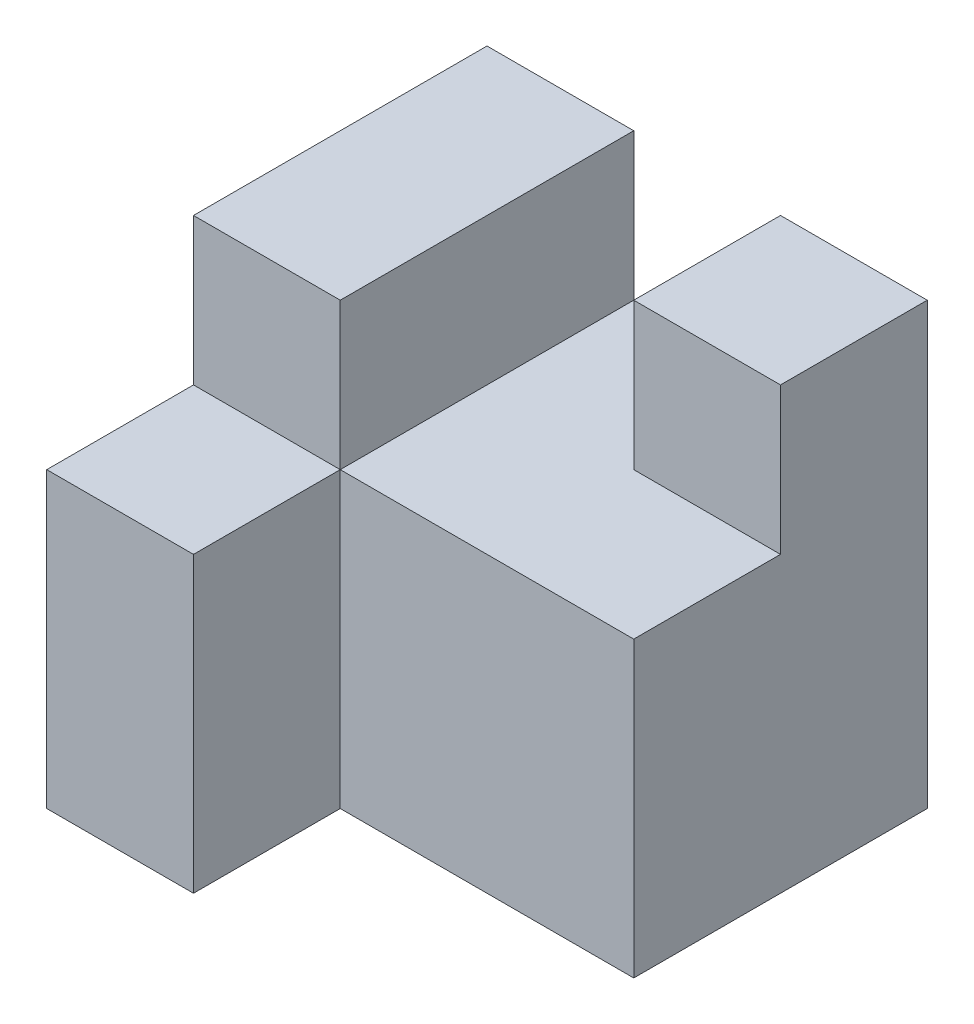
ISO-10303-21;
HEADER;
FILE_DESCRIPTION(('STEP AP214'),'2;1');
FILE_NAME('part.step','',(''),(''),'','','');
FILE_SCHEMA(('AUTOMOTIVE_DESIGN { 1 0 10303 214 1 1 1 1 }'));
ENDSEC;
DATA;
#1=APPLICATION_CONTEXT('core data for automotive mechanical design processes');
#2=APPLICATION_PROTOCOL_DEFINITION('international standard','automotive_design',2000,#1);
#3=PRODUCT_CONTEXT('',#1,'mechanical');
#4=PRODUCT('Part','Part','',(#3));
#5=PRODUCT_RELATED_PRODUCT_CATEGORY('part','',(#4));
#6=PRODUCT_DEFINITION_FORMATION('','',#4);
#7=PRODUCT_DEFINITION_CONTEXT('part definition',#1,'design');
#8=PRODUCT_DEFINITION('design','',#6,#7);
#9=PRODUCT_DEFINITION_SHAPE('','',#8);
#10=(LENGTH_UNIT() NAMED_UNIT(*) SI_UNIT(.MILLI.,.METRE.));
#11=(NAMED_UNIT(*) PLANE_ANGLE_UNIT() SI_UNIT($,.RADIAN.));
#12=(NAMED_UNIT(*) SI_UNIT($,.STERADIAN.) SOLID_ANGLE_UNIT());
#13=UNCERTAINTY_MEASURE_WITH_UNIT(LENGTH_MEASURE(1.E-05),#10,'distance_accuracy_value','');
#14=(GEOMETRIC_REPRESENTATION_CONTEXT(3) GLOBAL_UNCERTAINTY_ASSIGNED_CONTEXT((#13)) GLOBAL_UNIT_ASSIGNED_CONTEXT((#10,
#11,#12)) REPRESENTATION_CONTEXT('',''));
#15=CARTESIAN_POINT('',(0.,0.,0.));
#16=DIRECTION('',(0.,0.,1.));
#17=DIRECTION('',(1.,0.,0.));
#18=AXIS2_PLACEMENT_3D('',#15,#16,#17);
#19=CARTESIAN_POINT('',(10.,0.,-30.));
#20=DIRECTION('',(-1.,0.,0.));
#21=DIRECTION('',(0.,-1.,0.));
#22=AXIS2_PLACEMENT_3D('',#19,#20,#21);
#23=PLANE('',#22);
#24=DIRECTION('',(0.,0.,1.));
#25=VECTOR('',#24,1.);
#26=CARTESIAN_POINT('',(9.99999999999999,30.,-30.));
#27=LINE('',#26,#25);
#28=CARTESIAN_POINT('',(9.99999999999999,30.,-30.));
#29=VERTEX_POINT('',#28);
#30=CARTESIAN_POINT('',(9.99999999999999,30.,-10.));
#31=VERTEX_POINT('',#30);
#32=EDGE_CURVE('E165',#29,#31,#27,.T.);
#33=ORIENTED_EDGE('',*,*,#32,.T.);
#34=DIRECTION('',(0.,-1.,0.));
#35=VECTOR('',#34,1.);
#36=CARTESIAN_POINT('',(10.,0.,-10.));
#37=LINE('',#36,#35);
#38=CARTESIAN_POINT('',(10.,20.,-10.));
#39=VERTEX_POINT('',#38);
#40=EDGE_CURVE('E206',#31,#39,#37,.T.);
#41=ORIENTED_EDGE('',*,*,#40,.T.);
#42=DIRECTION('',(0.,0.,1.));
#43=VECTOR('',#42,1.);
#44=CARTESIAN_POINT('',(10.,20.,-30.));
#45=LINE('',#44,#43);
#46=CARTESIAN_POINT('',(10.,20.,-30.));
#47=VERTEX_POINT('',#46);
#48=EDGE_CURVE('E81',#47,#39,#45,.T.);
#49=ORIENTED_EDGE('',*,*,#48,.F.);
#50=DIRECTION('',(0.,-1.,0.));
#51=VECTOR('',#50,1.);
#52=CARTESIAN_POINT('',(10.,0.,-30.));
#53=LINE('',#52,#51);
#54=EDGE_CURVE('E169',#29,#47,#53,.T.);
#55=ORIENTED_EDGE('',*,*,#54,.F.);
#56=EDGE_LOOP('',(#33,#41,#49,#55));
#57=FACE_BOUND('',#56,.T.);
#58=ADVANCED_FACE('F33',(#57),#23,.F.);
#59=CARTESIAN_POINT('',(0.,30.,-30.));
#60=DIRECTION('',(0.,1.,0.));
#61=DIRECTION('',(0.,0.,1.));
#62=AXIS2_PLACEMENT_3D('',#59,#60,#61);
#63=PLANE('',#62);
#64=DIRECTION('',(1.,0.,0.));
#65=VECTOR('',#64,1.);
#66=CARTESIAN_POINT('',(0.,30.,-10.));
#67=LINE('',#66,#65);
#68=CARTESIAN_POINT('',(0.,30.,-10.));
#69=VERTEX_POINT('',#68);
#70=EDGE_CURVE('E237',#69,#31,#67,.T.);
#71=ORIENTED_EDGE('',*,*,#70,.T.);
#72=ORIENTED_EDGE('',*,*,#32,.F.);
#73=DIRECTION('',(-1.,0.,0.));
#74=VECTOR('',#73,1.);
#75=CARTESIAN_POINT('',(0.,30.,-30.));
#76=LINE('',#75,#74);
#77=CARTESIAN_POINT('',(0.,30.,-30.));
#78=VERTEX_POINT('',#77);
#79=EDGE_CURVE('E57',#29,#78,#76,.T.);
#80=ORIENTED_EDGE('',*,*,#79,.T.);
#81=DIRECTION('',(0.,0.,1.));
#82=VECTOR('',#81,1.);
#83=CARTESIAN_POINT('',(0.,30.,-30.));
#84=LINE('',#83,#82);
#85=EDGE_CURVE('E41',#78,#69,#84,.T.);
#86=ORIENTED_EDGE('',*,*,#85,.T.);
#87=EDGE_LOOP('',(#71,#72,#80,#86));
#88=FACE_BOUND('',#87,.T.);
#89=ADVANCED_FACE('F249',(#88),#63,.T.);
#90=CARTESIAN_POINT('',(0.,0.,-30.));
#91=DIRECTION('',(-1.,0.,0.));
#92=DIRECTION('',(0.,0.,1.));
#93=AXIS2_PLACEMENT_3D('',#90,#91,#92);
#94=PLANE('',#93);
#95=DIRECTION('',(0.,1.,0.));
#96=VECTOR('',#95,1.);
#97=CARTESIAN_POINT('',(0.,30.,-10.));
#98=LINE('',#97,#96);
#99=CARTESIAN_POINT('',(0.,20.,-10.));
#100=VERTEX_POINT('',#99);
#101=EDGE_CURVE('E230',#100,#69,#98,.T.);
#102=ORIENTED_EDGE('',*,*,#101,.T.);
#103=ORIENTED_EDGE('',*,*,#85,.F.);
#104=DIRECTION('',(0.,-1.,0.));
#105=VECTOR('',#104,1.);
#106=CARTESIAN_POINT('',(0.,0.,-30.));
#107=LINE('',#106,#105);
#108=CARTESIAN_POINT('',(0.,0.,-30.));
#109=VERTEX_POINT('',#108);
#110=EDGE_CURVE('E122',#78,#109,#107,.T.);
#111=ORIENTED_EDGE('',*,*,#110,.T.);
#112=DIRECTION('',(0.,0.,1.));
#113=VECTOR('',#112,1.);
#114=CARTESIAN_POINT('',(0.,0.,-30.));
#115=LINE('',#114,#113);
#116=CARTESIAN_POINT('',(0.,0.,0.));
#117=VERTEX_POINT('',#116);
#118=EDGE_CURVE('E106',#109,#117,#115,.T.);
#119=ORIENTED_EDGE('',*,*,#118,.T.);
#120=DIRECTION('',(0.,-1.,0.));
#121=VECTOR('',#120,1.);
#122=CARTESIAN_POINT('',(0.,0.,0.));
#123=LINE('',#122,#121);
#124=CARTESIAN_POINT('',(0.,20.,0.));
#125=VERTEX_POINT('',#124);
#126=EDGE_CURVE('E70',#125,#117,#123,.T.);
#127=ORIENTED_EDGE('',*,*,#126,.F.);
#128=DIRECTION('',(0.,0.,-1.));
#129=VECTOR('',#128,1.);
#130=CARTESIAN_POINT('',(0.,20.,-10.));
#131=LINE('',#130,#129);
#132=EDGE_CURVE('E235',#125,#100,#131,.T.);
#133=ORIENTED_EDGE('',*,*,#132,.T.);
#134=EDGE_LOOP('',(#102,#103,#111,#119,#127,#133));
#135=FACE_BOUND('',#134,.T.);
#136=ADVANCED_FACE('F35',(#135),#94,.T.);
#137=DIRECTION('',(1.,0.,0.));
#138=VECTOR('',#137,1.);
#139=CARTESIAN_POINT('',(15.,30.,-20.));
#140=LINE('',#139,#138);
#141=CARTESIAN_POINT('',(20.,30.,-20.));
#142=VERTEX_POINT('',#141);
#143=CARTESIAN_POINT('',(30.,30.,-20.));
#144=VERTEX_POINT('',#143);
#145=EDGE_CURVE('E174',#142,#144,#140,.T.);
#146=ORIENTED_EDGE('',*,*,#145,.T.);
#147=DIRECTION('',(0.,0.,1.));
#148=VECTOR('',#147,1.);
#149=CARTESIAN_POINT('',(30.,30.,-30.));
#150=LINE('',#149,#148);
#151=CARTESIAN_POINT('',(30.,30.,-30.));
#152=VERTEX_POINT('',#151);
#153=EDGE_CURVE('E105',#152,#144,#150,.T.);
#154=ORIENTED_EDGE('',*,*,#153,.F.);
#155=CARTESIAN_POINT('',(20.,30.,-30.));
#156=VERTEX_POINT('',#155);
#157=EDGE_CURVE('E117',#152,#156,#76,.T.);
#158=ORIENTED_EDGE('',*,*,#157,.T.);
#159=DIRECTION('',(0.,0.,1.));
#160=VECTOR('',#159,1.);
#161=CARTESIAN_POINT('',(20.,30.,-30.));
#162=LINE('',#161,#160);
#163=EDGE_CURVE('E156',#156,#142,#162,.T.);
#164=ORIENTED_EDGE('',*,*,#163,.T.);
#165=EDGE_LOOP('',(#146,#154,#158,#164));
#166=FACE_BOUND('',#165,.T.);
#167=ADVANCED_FACE('F171',(#166),#63,.T.);
#168=CARTESIAN_POINT('',(30.,0.,-30.));
#169=DIRECTION('',(1.,0.,0.));
#170=DIRECTION('',(0.,0.,-1.));
#171=AXIS2_PLACEMENT_3D('',#168,#169,#170);
#172=PLANE('',#171);
#173=DIRECTION('',(0.,1.,0.));
#174=VECTOR('',#173,1.);
#175=CARTESIAN_POINT('',(30.,30.,-20.));
#176=LINE('',#175,#174);
#177=CARTESIAN_POINT('',(30.,20.,-20.));
#178=VERTEX_POINT('',#177);
#179=EDGE_CURVE('E177',#178,#144,#176,.T.);
#180=ORIENTED_EDGE('',*,*,#179,.F.);
#181=DIRECTION('',(0.,0.,-1.));
#182=VECTOR('',#181,1.);
#183=CARTESIAN_POINT('',(30.,20.,-10.));
#184=LINE('',#183,#182);
#185=CARTESIAN_POINT('',(30.,20.,-10.));
#186=VERTEX_POINT('',#185);
#187=EDGE_CURVE('E228',#186,#178,#184,.T.);
#188=ORIENTED_EDGE('',*,*,#187,.F.);
#189=DIRECTION('',(0.,1.,0.));
#190=VECTOR('',#189,1.);
#191=CARTESIAN_POINT('',(30.,0.,-10.));
#192=LINE('',#191,#190);
#193=CARTESIAN_POINT('',(30.,0.,-10.));
#194=VERTEX_POINT('',#193);
#195=EDGE_CURVE('E101',#194,#186,#192,.T.);
#196=ORIENTED_EDGE('',*,*,#195,.F.);
#197=DIRECTION('',(0.,0.,1.));
#198=VECTOR('',#197,1.);
#199=CARTESIAN_POINT('',(30.,0.,-30.));
#200=LINE('',#199,#198);
#201=CARTESIAN_POINT('',(30.,0.,-30.));
#202=VERTEX_POINT('',#201);
#203=EDGE_CURVE('E91',#202,#194,#200,.T.);
#204=ORIENTED_EDGE('',*,*,#203,.F.);
#205=DIRECTION('',(0.,1.,0.));
#206=VECTOR('',#205,1.);
#207=CARTESIAN_POINT('',(30.,0.,-30.));
#208=LINE('',#207,#206);
#209=EDGE_CURVE('E96',#202,#152,#208,.T.);
#210=ORIENTED_EDGE('',*,*,#209,.T.);
#211=ORIENTED_EDGE('',*,*,#153,.T.);
#212=EDGE_LOOP('',(#180,#188,#196,#204,#210,#211));
#213=FACE_BOUND('',#212,.T.);
#214=ADVANCED_FACE('F94',(#213),#172,.T.);
#215=CARTESIAN_POINT('',(0.,0.,-30.));
#216=DIRECTION('',(0.,-1.,0.));
#217=DIRECTION('',(0.,0.,-1.));
#218=AXIS2_PLACEMENT_3D('',#215,#216,#217);
#219=PLANE('',#218);
#220=DIRECTION('',(0.,0.,1.));
#221=VECTOR('',#220,1.);
#222=CARTESIAN_POINT('',(10.,0.,0.));
#223=LINE('',#222,#221);
#224=CARTESIAN_POINT('',(10.,0.,-10.));
#225=VERTEX_POINT('',#224);
#226=CARTESIAN_POINT('',(10.,0.,0.));
#227=VERTEX_POINT('',#226);
#228=EDGE_CURVE('E138',#225,#227,#223,.T.);
#229=ORIENTED_EDGE('',*,*,#228,.T.);
#230=DIRECTION('',(1.,0.,0.));
#231=VECTOR('',#230,1.);
#232=CARTESIAN_POINT('',(0.,0.,0.));
#233=LINE('',#232,#231);
#234=EDGE_CURVE('E124',#117,#227,#233,.T.);
#235=ORIENTED_EDGE('',*,*,#234,.F.);
#236=ORIENTED_EDGE('',*,*,#118,.F.);
#237=DIRECTION('',(1.,0.,0.));
#238=VECTOR('',#237,1.);
#239=CARTESIAN_POINT('',(0.,0.,-30.));
#240=LINE('',#239,#238);
#241=EDGE_CURVE('E113',#109,#202,#240,.T.);
#242=ORIENTED_EDGE('',*,*,#241,.T.);
#243=ORIENTED_EDGE('',*,*,#203,.T.);
#244=DIRECTION('',(-1.,0.,0.));
#245=VECTOR('',#244,1.);
#246=CARTESIAN_POINT('',(30.,0.,-10.));
#247=LINE('',#246,#245);
#248=EDGE_CURVE('E201',#194,#225,#247,.T.);
#249=ORIENTED_EDGE('',*,*,#248,.T.);
#250=EDGE_LOOP('',(#229,#235,#236,#242,#243,#249));
#251=FACE_BOUND('',#250,.T.);
#252=ADVANCED_FACE('F120',(#251),#219,.T.);
#253=CARTESIAN_POINT('',(0.,0.,-30.));
#254=DIRECTION('',(0.,0.,-1.));
#255=DIRECTION('',(-1.,0.,0.));
#256=AXIS2_PLACEMENT_3D('',#253,#254,#255);
#257=PLANE('',#256);
#258=ORIENTED_EDGE('',*,*,#54,.T.);
#259=DIRECTION('',(1.,0.,0.));
#260=VECTOR('',#259,1.);
#261=CARTESIAN_POINT('',(0.,20.,-30.));
#262=LINE('',#261,#260);
#263=CARTESIAN_POINT('',(20.,20.,-30.));
#264=VERTEX_POINT('',#263);
#265=EDGE_CURVE('E168',#47,#264,#262,.T.);
#266=ORIENTED_EDGE('',*,*,#265,.T.);
#267=DIRECTION('',(0.,1.,0.));
#268=VECTOR('',#267,1.);
#269=CARTESIAN_POINT('',(20.,0.,-30.));
#270=LINE('',#269,#268);
#271=EDGE_CURVE('E159',#264,#156,#270,.T.);
#272=ORIENTED_EDGE('',*,*,#271,.T.);
#273=ORIENTED_EDGE('',*,*,#157,.F.);
#274=ORIENTED_EDGE('',*,*,#209,.F.);
#275=ORIENTED_EDGE('',*,*,#241,.F.);
#276=ORIENTED_EDGE('',*,*,#110,.F.);
#277=ORIENTED_EDGE('',*,*,#79,.F.);
#278=EDGE_LOOP('',(#258,#266,#272,#273,#274,#275,#276,#277));
#279=FACE_BOUND('',#278,.T.);
#280=ADVANCED_FACE('F111',(#279),#257,.T.);
#281=CARTESIAN_POINT('',(0.,0.,0.));
#282=DIRECTION('',(0.,0.,-1.));
#283=DIRECTION('',(-1.,0.,0.));
#284=AXIS2_PLACEMENT_3D('',#281,#282,#283);
#285=PLANE('',#284);
#286=DIRECTION('',(0.,-1.,0.));
#287=VECTOR('',#286,1.);
#288=CARTESIAN_POINT('',(10.,0.,0.));
#289=LINE('',#288,#287);
#290=CARTESIAN_POINT('',(10.,20.,0.));
#291=VERTEX_POINT('',#290);
#292=EDGE_CURVE('E142',#291,#227,#289,.T.);
#293=ORIENTED_EDGE('',*,*,#292,.F.);
#294=DIRECTION('',(1.,0.,0.));
#295=VECTOR('',#294,1.);
#296=CARTESIAN_POINT('',(0.,20.,0.));
#297=LINE('',#296,#295);
#298=EDGE_CURVE('E48',#125,#291,#297,.T.);
#299=ORIENTED_EDGE('',*,*,#298,.F.);
#300=ORIENTED_EDGE('',*,*,#126,.T.);
#301=ORIENTED_EDGE('',*,*,#234,.T.);
#302=EDGE_LOOP('',(#293,#299,#300,#301));
#303=FACE_BOUND('',#302,.T.);
#304=ADVANCED_FACE('F140',(#303),#285,.F.);
#305=CARTESIAN_POINT('',(0.,20.,-30.));
#306=DIRECTION('',(0.,-1.,0.));
#307=DIRECTION('',(0.,0.,-1.));
#308=AXIS2_PLACEMENT_3D('',#305,#306,#307);
#309=PLANE('',#308);
#310=DIRECTION('',(1.,0.,0.));
#311=VECTOR('',#310,1.);
#312=CARTESIAN_POINT('',(15.,20.,-20.));
#313=LINE('',#312,#311);
#314=CARTESIAN_POINT('',(20.,20.,-20.));
#315=VERTEX_POINT('',#314);
#316=EDGE_CURVE('E227',#315,#178,#313,.T.);
#317=ORIENTED_EDGE('',*,*,#316,.F.);
#318=DIRECTION('',(0.,0.,1.));
#319=VECTOR('',#318,1.);
#320=CARTESIAN_POINT('',(20.,20.,-30.));
#321=LINE('',#320,#319);
#322=EDGE_CURVE('E166',#264,#315,#321,.T.);
#323=ORIENTED_EDGE('',*,*,#322,.F.);
#324=ORIENTED_EDGE('',*,*,#265,.F.);
#325=ORIENTED_EDGE('',*,*,#48,.T.);
#326=DIRECTION('',(1.,0.,0.));
#327=VECTOR('',#326,1.);
#328=CARTESIAN_POINT('',(0.,20.,-9.99999999999999));
#329=LINE('',#328,#327);
#330=EDGE_CURVE('E214',#39,#186,#329,.T.);
#331=ORIENTED_EDGE('',*,*,#330,.T.);
#332=ORIENTED_EDGE('',*,*,#187,.T.);
#333=EDGE_LOOP('',(#317,#323,#324,#325,#331,#332));
#334=FACE_BOUND('',#333,.T.);
#335=ADVANCED_FACE('F225',(#334),#309,.F.);
#336=DIRECTION('',(0.,1.,0.));
#337=VECTOR('',#336,1.);
#338=CARTESIAN_POINT('',(10.,0.,-10.));
#339=LINE('',#338,#337);
#340=EDGE_CURVE('E205',#225,#39,#339,.T.);
#341=ORIENTED_EDGE('',*,*,#340,.T.);
#342=DIRECTION('',(0.,0.,1.));
#343=VECTOR('',#342,1.);
#344=CARTESIAN_POINT('',(10.,20.,-30.));
#345=LINE('',#344,#343);
#346=EDGE_CURVE('E209',#39,#291,#345,.T.);
#347=ORIENTED_EDGE('',*,*,#346,.T.);
#348=ORIENTED_EDGE('',*,*,#292,.T.);
#349=ORIENTED_EDGE('',*,*,#228,.F.);
#350=EDGE_LOOP('',(#341,#347,#348,#349));
#351=FACE_BOUND('',#350,.T.);
#352=ADVANCED_FACE('F243',(#351),#23,.F.);
#353=CARTESIAN_POINT('',(20.,0.,-30.));
#354=DIRECTION('',(1.,0.,0.));
#355=DIRECTION('',(0.,0.,-1.));
#356=AXIS2_PLACEMENT_3D('',#353,#354,#355);
#357=PLANE('',#356);
#358=ORIENTED_EDGE('',*,*,#322,.T.);
#359=DIRECTION('',(0.,1.,0.));
#360=VECTOR('',#359,1.);
#361=CARTESIAN_POINT('',(20.,0.,-20.));
#362=LINE('',#361,#360);
#363=EDGE_CURVE('E11',#315,#142,#362,.T.);
#364=ORIENTED_EDGE('',*,*,#363,.T.);
#365=ORIENTED_EDGE('',*,*,#163,.F.);
#366=ORIENTED_EDGE('',*,*,#271,.F.);
#367=EDGE_LOOP('',(#358,#364,#365,#366));
#368=FACE_BOUND('',#367,.T.);
#369=ADVANCED_FACE('F158',(#368),#357,.F.);
#370=CARTESIAN_POINT('',(30.,0.,-10.));
#371=DIRECTION('',(0.,0.,-1.));
#372=DIRECTION('',(-1.,0.,0.));
#373=AXIS2_PLACEMENT_3D('',#370,#371,#372);
#374=PLANE('',#373);
#375=ORIENTED_EDGE('',*,*,#195,.T.);
#376=ORIENTED_EDGE('',*,*,#330,.F.);
#377=ORIENTED_EDGE('',*,*,#340,.F.);
#378=ORIENTED_EDGE('',*,*,#248,.F.);
#379=EDGE_LOOP('',(#375,#376,#377,#378));
#380=FACE_BOUND('',#379,.T.);
#381=ADVANCED_FACE('F202',(#380),#374,.F.);
#382=CARTESIAN_POINT('',(0.,30.,-10.));
#383=DIRECTION('',(0.,0.,-1.));
#384=DIRECTION('',(0.,1.,0.));
#385=AXIS2_PLACEMENT_3D('',#382,#383,#384);
#386=PLANE('',#385);
#387=ORIENTED_EDGE('',*,*,#70,.F.);
#388=ORIENTED_EDGE('',*,*,#101,.F.);
#389=DIRECTION('',(1.,0.,0.));
#390=VECTOR('',#389,1.);
#391=CARTESIAN_POINT('',(0.,20.,-10.));
#392=LINE('',#391,#390);
#393=EDGE_CURVE('E238',#100,#39,#392,.T.);
#394=ORIENTED_EDGE('',*,*,#393,.T.);
#395=ORIENTED_EDGE('',*,*,#40,.F.);
#396=EDGE_LOOP('',(#387,#388,#394,#395));
#397=FACE_BOUND('',#396,.T.);
#398=ADVANCED_FACE('F247',(#397),#386,.F.);
#399=CARTESIAN_POINT('',(0.,20.,-10.));
#400=DIRECTION('',(0.,-1.,0.));
#401=DIRECTION('',(0.,0.,-1.));
#402=AXIS2_PLACEMENT_3D('',#399,#400,#401);
#403=PLANE('',#402);
#404=ORIENTED_EDGE('',*,*,#393,.F.);
#405=ORIENTED_EDGE('',*,*,#132,.F.);
#406=ORIENTED_EDGE('',*,*,#298,.T.);
#407=ORIENTED_EDGE('',*,*,#346,.F.);
#408=EDGE_LOOP('',(#404,#405,#406,#407));
#409=FACE_BOUND('',#408,.T.);
#410=ADVANCED_FACE('F244',(#409),#403,.F.);
#411=CARTESIAN_POINT('',(15.,30.,-20.));
#412=DIRECTION('',(0.,0.,-1.));
#413=DIRECTION('',(-1.,0.,0.));
#414=AXIS2_PLACEMENT_3D('',#411,#412,#413);
#415=PLANE('',#414);
#416=ORIENTED_EDGE('',*,*,#316,.T.);
#417=ORIENTED_EDGE('',*,*,#179,.T.);
#418=ORIENTED_EDGE('',*,*,#145,.F.);
#419=ORIENTED_EDGE('',*,*,#363,.F.);
#420=EDGE_LOOP('',(#416,#417,#418,#419));
#421=FACE_BOUND('',#420,.T.);
#422=ADVANCED_FACE('F288',(#421),#415,.F.);
#423=CLOSED_SHELL('',(#58,#89,#136,#167,#214,#252,#280,#304,#335,#352,#369,#381,#398,#410,#422));
#424=MANIFOLD_SOLID_BREP('B2',#423);
#425=ADVANCED_BREP_SHAPE_REPRESENTATION('',(#18,#424),#14);
#426=SHAPE_DEFINITION_REPRESENTATION(#9,#425);
ENDSEC;
END-ISO-10303-21;
